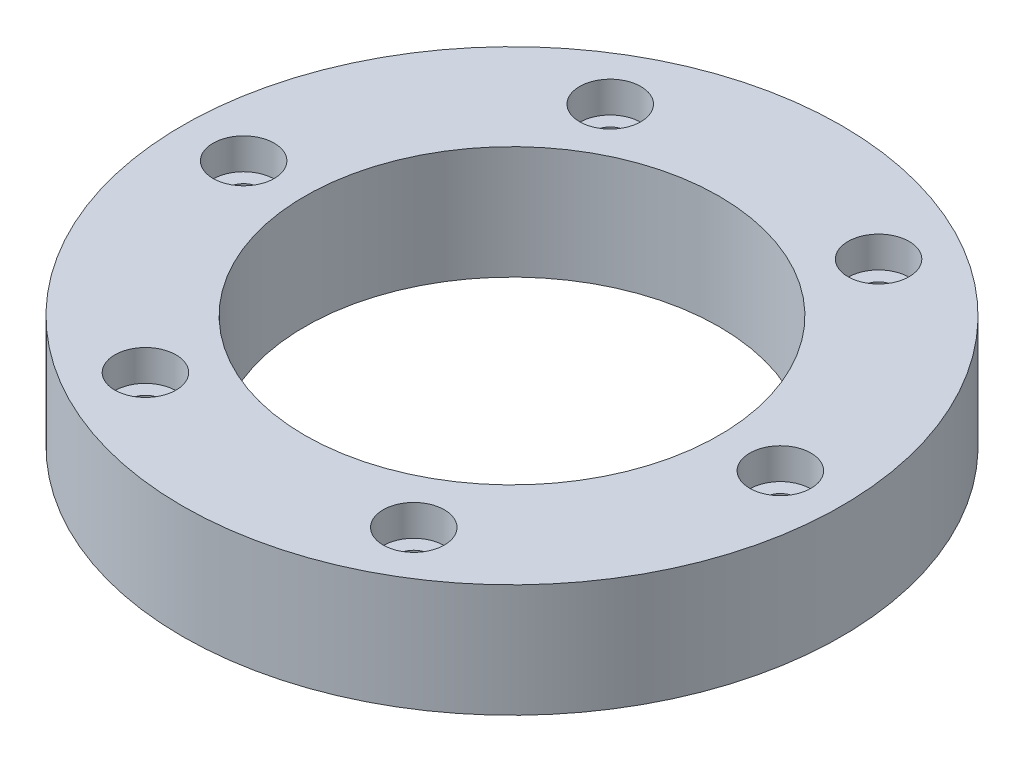
ISO-10303-21;
HEADER;
FILE_DESCRIPTION(('STEP AP214'),'2;1');
FILE_NAME('part.step','',(''),(''),'','','');
FILE_SCHEMA(('AUTOMOTIVE_DESIGN { 1 0 10303 214 1 1 1 1 }'));
ENDSEC;
DATA;
#1=APPLICATION_CONTEXT('core data for automotive mechanical design processes');
#2=APPLICATION_PROTOCOL_DEFINITION('international standard','automotive_design',2000,#1);
#3=PRODUCT_CONTEXT('',#1,'mechanical');
#4=PRODUCT('Part','Part','',(#3));
#5=PRODUCT_RELATED_PRODUCT_CATEGORY('part','',(#4));
#6=PRODUCT_DEFINITION_FORMATION('','',#4);
#7=PRODUCT_DEFINITION_CONTEXT('part definition',#1,'design');
#8=PRODUCT_DEFINITION('design','',#6,#7);
#9=PRODUCT_DEFINITION_SHAPE('','',#8);
#10=(LENGTH_UNIT() NAMED_UNIT(*) SI_UNIT(.MILLI.,.METRE.));
#11=(NAMED_UNIT(*) PLANE_ANGLE_UNIT() SI_UNIT($,.RADIAN.));
#12=(NAMED_UNIT(*) SI_UNIT($,.STERADIAN.) SOLID_ANGLE_UNIT());
#13=UNCERTAINTY_MEASURE_WITH_UNIT(LENGTH_MEASURE(1.E-05),#10,'distance_accuracy_value','');
#14=(GEOMETRIC_REPRESENTATION_CONTEXT(3) GLOBAL_UNCERTAINTY_ASSIGNED_CONTEXT((#13)) GLOBAL_UNIT_ASSIGNED_CONTEXT((#10,
#11,#12)) REPRESENTATION_CONTEXT('',''));
#15=CARTESIAN_POINT('',(0.,0.,0.));
#16=DIRECTION('',(0.,0.,1.));
#17=DIRECTION('',(1.,0.,0.));
#18=AXIS2_PLACEMENT_3D('',#15,#16,#17);
#19=CARTESIAN_POINT('',(-28.5,12.,0.));
#20=DIRECTION('',(0.,-1.,0.));
#21=DIRECTION('',(0.,0.,-1.));
#22=AXIS2_PLACEMENT_3D('',#19,#20,#21);
#23=CYLINDRICAL_SURFACE('',#22,1.7);
#24=CARTESIAN_POINT('',(-28.5,0.,0.));
#25=DIRECTION('',(0.,1.,0.));
#26=DIRECTION('',(0.,0.,1.));
#27=AXIS2_PLACEMENT_3D('',#24,#25,#26);
#28=CIRCLE('',#27,1.7);
#29=CARTESIAN_POINT('',(-28.5,0.,1.7));
#30=VERTEX_POINT('',#29);
#31=EDGE_CURVE('E49',#30,#30,#28,.T.);
#32=ORIENTED_EDGE('',*,*,#31,.F.);
#33=EDGE_LOOP('',(#32));
#34=FACE_BOUND('',#33,.T.);
#35=CARTESIAN_POINT('',(-28.5,8.7,0.));
#36=DIRECTION('',(0.,1.,0.));
#37=DIRECTION('',(0.,0.,1.));
#38=AXIS2_PLACEMENT_3D('',#35,#36,#37);
#39=CIRCLE('',#38,1.7);
#40=CARTESIAN_POINT('',(-28.5,8.7,1.7));
#41=VERTEX_POINT('',#40);
#42=EDGE_CURVE('E40',#41,#41,#39,.T.);
#43=ORIENTED_EDGE('',*,*,#42,.T.);
#44=EDGE_LOOP('',(#43));
#45=FACE_BOUND('',#44,.T.);
#46=ADVANCED_FACE('F36',(#34,#45),#23,.F.);
#47=CARTESIAN_POINT('',(-14.2499999999999,12.,-24.6817240078565));
#48=DIRECTION('',(0.,-1.,0.));
#49=DIRECTION('',(0.,0.,-1.));
#50=AXIS2_PLACEMENT_3D('',#47,#48,#49);
#51=CYLINDRICAL_SURFACE('',#50,1.7);
#52=CARTESIAN_POINT('',(-14.2499999999999,0.,-24.6817240078565));
#53=DIRECTION('',(0.,1.,0.));
#54=DIRECTION('',(0.,0.,1.));
#55=AXIS2_PLACEMENT_3D('',#52,#53,#54);
#56=CIRCLE('',#55,1.7);
#57=CARTESIAN_POINT('',(-14.2499999999999,0.,-22.9817240078565));
#58=VERTEX_POINT('',#57);
#59=EDGE_CURVE('E91',#58,#58,#56,.T.);
#60=ORIENTED_EDGE('',*,*,#59,.F.);
#61=EDGE_LOOP('',(#60));
#62=FACE_BOUND('',#61,.T.);
#63=CARTESIAN_POINT('',(-14.2499999999999,8.7,-24.6817240078565));
#64=DIRECTION('',(0.,1.,0.));
#65=DIRECTION('',(0.,0.,1.));
#66=AXIS2_PLACEMENT_3D('',#63,#64,#65);
#67=CIRCLE('',#66,1.7);
#68=CARTESIAN_POINT('',(-14.2499999999999,8.7,-22.9817240078565));
#69=VERTEX_POINT('',#68);
#70=EDGE_CURVE('E66',#69,#69,#67,.T.);
#71=ORIENTED_EDGE('',*,*,#70,.T.);
#72=EDGE_LOOP('',(#71));
#73=FACE_BOUND('',#72,.T.);
#74=ADVANCED_FACE('F119',(#62,#73),#51,.F.);
#75=CARTESIAN_POINT('',(14.2500000000001,12.,-24.6817240078564));
#76=DIRECTION('',(0.,-1.,0.));
#77=DIRECTION('',(0.,0.,-1.));
#78=AXIS2_PLACEMENT_3D('',#75,#76,#77);
#79=CYLINDRICAL_SURFACE('',#78,1.7);
#80=CARTESIAN_POINT('',(14.2500000000001,0.,-24.6817240078564));
#81=DIRECTION('',(0.,1.,0.));
#82=DIRECTION('',(0.,0.,1.));
#83=AXIS2_PLACEMENT_3D('',#80,#81,#82);
#84=CIRCLE('',#83,1.7);
#85=CARTESIAN_POINT('',(14.2500000000001,0.,-22.9817240078564));
#86=VERTEX_POINT('',#85);
#87=EDGE_CURVE('E88',#86,#86,#84,.T.);
#88=ORIENTED_EDGE('',*,*,#87,.F.);
#89=EDGE_LOOP('',(#88));
#90=FACE_BOUND('',#89,.T.);
#91=CARTESIAN_POINT('',(14.2500000000001,8.7,-24.6817240078564));
#92=DIRECTION('',(0.,1.,0.));
#93=DIRECTION('',(0.,0.,1.));
#94=AXIS2_PLACEMENT_3D('',#91,#92,#93);
#95=CIRCLE('',#94,1.7);
#96=CARTESIAN_POINT('',(14.2500000000001,8.7,-22.9817240078564));
#97=VERTEX_POINT('',#96);
#98=EDGE_CURVE('E64',#97,#97,#95,.T.);
#99=ORIENTED_EDGE('',*,*,#98,.T.);
#100=EDGE_LOOP('',(#99));
#101=FACE_BOUND('',#100,.T.);
#102=ADVANCED_FACE('F124',(#90,#101),#79,.F.);
#103=CARTESIAN_POINT('',(28.5,12.,1.99014436314059E-13));
#104=DIRECTION('',(0.,-1.,0.));
#105=DIRECTION('',(0.,0.,-1.));
#106=AXIS2_PLACEMENT_3D('',#103,#104,#105);
#107=CYLINDRICAL_SURFACE('',#106,1.7);
#108=CARTESIAN_POINT('',(28.5,0.,1.99014436314059E-13));
#109=DIRECTION('',(0.,1.,0.));
#110=DIRECTION('',(0.,0.,1.));
#111=AXIS2_PLACEMENT_3D('',#108,#109,#110);
#112=CIRCLE('',#111,1.7);
#113=CARTESIAN_POINT('',(28.5,0.,1.7000000000002));
#114=VERTEX_POINT('',#113);
#115=EDGE_CURVE('E80',#114,#114,#112,.T.);
#116=ORIENTED_EDGE('',*,*,#115,.F.);
#117=EDGE_LOOP('',(#116));
#118=FACE_BOUND('',#117,.T.);
#119=CARTESIAN_POINT('',(28.5,8.7,1.99014436314059E-13));
#120=DIRECTION('',(0.,1.,0.));
#121=DIRECTION('',(0.,0.,1.));
#122=AXIS2_PLACEMENT_3D('',#119,#120,#121);
#123=CIRCLE('',#122,1.7);
#124=CARTESIAN_POINT('',(28.5,8.7,1.7000000000002));
#125=VERTEX_POINT('',#124);
#126=EDGE_CURVE('E61',#125,#125,#123,.T.);
#127=ORIENTED_EDGE('',*,*,#126,.T.);
#128=EDGE_LOOP('',(#127));
#129=FACE_BOUND('',#128,.T.);
#130=ADVANCED_FACE('F174',(#118,#129),#107,.F.);
#131=CARTESIAN_POINT('',(14.2499999999998,12.,24.6817240078566));
#132=DIRECTION('',(0.,-1.,0.));
#133=DIRECTION('',(0.,0.,-1.));
#134=AXIS2_PLACEMENT_3D('',#131,#132,#133);
#135=CYLINDRICAL_SURFACE('',#134,1.7);
#136=CARTESIAN_POINT('',(14.2499999999998,0.,24.6817240078566));
#137=DIRECTION('',(0.,1.,0.));
#138=DIRECTION('',(0.,0.,1.));
#139=AXIS2_PLACEMENT_3D('',#136,#137,#138);
#140=CIRCLE('',#139,1.7);
#141=CARTESIAN_POINT('',(14.2499999999998,0.,26.3817240078566));
#142=VERTEX_POINT('',#141);
#143=EDGE_CURVE('E75',#142,#142,#140,.T.);
#144=ORIENTED_EDGE('',*,*,#143,.F.);
#145=EDGE_LOOP('',(#144));
#146=FACE_BOUND('',#145,.T.);
#147=CARTESIAN_POINT('',(14.2499999999998,8.7,24.6817240078566));
#148=DIRECTION('',(0.,1.,0.));
#149=DIRECTION('',(0.,0.,1.));
#150=AXIS2_PLACEMENT_3D('',#147,#148,#149);
#151=CIRCLE('',#150,1.7);
#152=CARTESIAN_POINT('',(14.2499999999998,8.7,26.3817240078566));
#153=VERTEX_POINT('',#152);
#154=EDGE_CURVE('E57',#153,#153,#151,.T.);
#155=ORIENTED_EDGE('',*,*,#154,.T.);
#156=EDGE_LOOP('',(#155));
#157=FACE_BOUND('',#156,.T.);
#158=ADVANCED_FACE('F184',(#146,#157),#135,.F.);
#159=CARTESIAN_POINT('',(-14.2500000000003,12.,24.6817240078563));
#160=DIRECTION('',(0.,-1.,0.));
#161=DIRECTION('',(0.,0.,-1.));
#162=AXIS2_PLACEMENT_3D('',#159,#160,#161);
#163=CYLINDRICAL_SURFACE('',#162,1.7);
#164=CARTESIAN_POINT('',(-14.2500000000003,0.,24.6817240078563));
#165=DIRECTION('',(0.,1.,0.));
#166=DIRECTION('',(0.,0.,1.));
#167=AXIS2_PLACEMENT_3D('',#164,#165,#166);
#168=CIRCLE('',#167,1.7);
#169=CARTESIAN_POINT('',(-14.2500000000003,0.,26.3817240078563));
#170=VERTEX_POINT('',#169);
#171=EDGE_CURVE('E71',#170,#170,#168,.T.);
#172=ORIENTED_EDGE('',*,*,#171,.F.);
#173=EDGE_LOOP('',(#172));
#174=FACE_BOUND('',#173,.T.);
#175=CARTESIAN_POINT('',(-14.2500000000003,8.7,24.6817240078563));
#176=DIRECTION('',(0.,1.,0.));
#177=DIRECTION('',(0.,0.,1.));
#178=AXIS2_PLACEMENT_3D('',#175,#176,#177);
#179=CIRCLE('',#178,1.7);
#180=CARTESIAN_POINT('',(-14.2500000000003,8.7,26.3817240078563));
#181=VERTEX_POINT('',#180);
#182=EDGE_CURVE('E54',#181,#181,#179,.T.);
#183=ORIENTED_EDGE('',*,*,#182,.T.);
#184=EDGE_LOOP('',(#183));
#185=FACE_BOUND('',#184,.T.);
#186=ADVANCED_FACE('F130',(#174,#185),#163,.F.);
#187=CARTESIAN_POINT('',(0.,12.,0.));
#188=DIRECTION('',(0.,1.,0.));
#189=DIRECTION('',(0.,0.,1.));
#190=AXIS2_PLACEMENT_3D('',#187,#188,#189);
#191=PLANE('',#190);
#192=CARTESIAN_POINT('',(-28.5,12.,0.));
#193=DIRECTION('',(0.,1.,0.));
#194=DIRECTION('',(0.,0.,1.));
#195=AXIS2_PLACEMENT_3D('',#192,#193,#194);
#196=CIRCLE('',#195,3.25);
#197=CARTESIAN_POINT('',(-28.5,12.,3.25));
#198=VERTEX_POINT('',#197);
#199=EDGE_CURVE('E351',#198,#198,#196,.T.);
#200=ORIENTED_EDGE('',*,*,#199,.F.);
#201=EDGE_LOOP('',(#200));
#202=FACE_BOUND('',#201,.T.);
#203=CARTESIAN_POINT('',(-14.2500000000003,12.,24.6817240078563));
#204=DIRECTION('',(0.,1.,0.));
#205=DIRECTION('',(0.,0.,1.));
#206=AXIS2_PLACEMENT_3D('',#203,#204,#205);
#207=CIRCLE('',#206,3.25);
#208=CARTESIAN_POINT('',(-14.2500000000003,12.,27.9317240078563));
#209=VERTEX_POINT('',#208);
#210=EDGE_CURVE('E357',#209,#209,#207,.T.);
#211=ORIENTED_EDGE('',*,*,#210,.F.);
#212=EDGE_LOOP('',(#211));
#213=FACE_BOUND('',#212,.T.);
#214=CARTESIAN_POINT('',(14.2499999999998,12.,24.6817240078566));
#215=DIRECTION('',(0.,1.,0.));
#216=DIRECTION('',(0.,0.,1.));
#217=AXIS2_PLACEMENT_3D('',#214,#215,#216);
#218=CIRCLE('',#217,3.25);
#219=CARTESIAN_POINT('',(14.2499999999998,12.,27.9317240078566));
#220=VERTEX_POINT('',#219);
#221=EDGE_CURVE('E379',#220,#220,#218,.T.);
#222=ORIENTED_EDGE('',*,*,#221,.F.);
#223=EDGE_LOOP('',(#222));
#224=FACE_BOUND('',#223,.T.);
#225=CARTESIAN_POINT('',(28.5,12.,1.99014436314059E-13));
#226=DIRECTION('',(0.,1.,0.));
#227=DIRECTION('',(0.,0.,1.));
#228=AXIS2_PLACEMENT_3D('',#225,#226,#227);
#229=CIRCLE('',#228,3.25);
#230=CARTESIAN_POINT('',(28.5,12.,3.2500000000002));
#231=VERTEX_POINT('',#230);
#232=EDGE_CURVE('E374',#231,#231,#229,.T.);
#233=ORIENTED_EDGE('',*,*,#232,.F.);
#234=EDGE_LOOP('',(#233));
#235=FACE_BOUND('',#234,.T.);
#236=CARTESIAN_POINT('',(14.2500000000001,12.,-24.6817240078564));
#237=DIRECTION('',(0.,1.,0.));
#238=DIRECTION('',(0.,0.,1.));
#239=AXIS2_PLACEMENT_3D('',#236,#237,#238);
#240=CIRCLE('',#239,3.25);
#241=CARTESIAN_POINT('',(14.2500000000001,12.,-21.4317240078564));
#242=VERTEX_POINT('',#241);
#243=EDGE_CURVE('E368',#242,#242,#240,.T.);
#244=ORIENTED_EDGE('',*,*,#243,.F.);
#245=EDGE_LOOP('',(#244));
#246=FACE_BOUND('',#245,.T.);
#247=CARTESIAN_POINT('',(-14.2499999999999,12.,-24.6817240078565));
#248=DIRECTION('',(0.,1.,0.));
#249=DIRECTION('',(0.,0.,1.));
#250=AXIS2_PLACEMENT_3D('',#247,#248,#249);
#251=CIRCLE('',#250,3.25);
#252=CARTESIAN_POINT('',(-14.2499999999999,12.,-21.4317240078565));
#253=VERTEX_POINT('',#252);
#254=EDGE_CURVE('E354',#253,#253,#251,.T.);
#255=ORIENTED_EDGE('',*,*,#254,.F.);
#256=EDGE_LOOP('',(#255));
#257=FACE_BOUND('',#256,.T.);
#258=CARTESIAN_POINT('',(0.,12.,0.));
#259=DIRECTION('',(0.,1.,0.));
#260=DIRECTION('',(0.,0.,1.));
#261=AXIS2_PLACEMENT_3D('',#258,#259,#260);
#262=CIRCLE('',#261,22.);
#263=CARTESIAN_POINT('',(0.,12.,22.));
#264=VERTEX_POINT('',#263);
#265=EDGE_CURVE('E95',#264,#264,#262,.T.);
#266=ORIENTED_EDGE('',*,*,#265,.F.);
#267=EDGE_LOOP('',(#266));
#268=FACE_BOUND('',#267,.T.);
#269=CARTESIAN_POINT('',(0.,12.,0.));
#270=DIRECTION('',(0.,1.,0.));
#271=DIRECTION('',(0.,0.,1.));
#272=AXIS2_PLACEMENT_3D('',#269,#270,#271);
#273=CIRCLE('',#272,35.);
#274=CARTESIAN_POINT('',(0.,12.,35.));
#275=VERTEX_POINT('',#274);
#276=EDGE_CURVE('E10',#275,#275,#273,.T.);
#277=ORIENTED_EDGE('',*,*,#276,.T.);
#278=EDGE_LOOP('',(#277));
#279=FACE_BOUND('',#278,.T.);
#280=ADVANCED_FACE('F128',(#202,#213,#224,#235,#246,#257,#268,#279),#191,.T.);
#281=CARTESIAN_POINT('',(0.,0.,0.));
#282=DIRECTION('',(0.,1.,0.));
#283=DIRECTION('',(0.,0.,1.));
#284=AXIS2_PLACEMENT_3D('',#281,#282,#283);
#285=PLANE('',#284);
#286=CARTESIAN_POINT('',(0.,0.,0.));
#287=DIRECTION('',(0.,1.,0.));
#288=DIRECTION('',(0.,0.,1.));
#289=AXIS2_PLACEMENT_3D('',#286,#287,#288);
#290=CIRCLE('',#289,35.);
#291=CARTESIAN_POINT('',(0.,0.,35.));
#292=VERTEX_POINT('',#291);
#293=EDGE_CURVE('E44',#292,#292,#290,.T.);
#294=ORIENTED_EDGE('',*,*,#293,.F.);
#295=EDGE_LOOP('',(#294));
#296=FACE_BOUND('',#295,.T.);
#297=ORIENTED_EDGE('',*,*,#31,.T.);
#298=EDGE_LOOP('',(#297));
#299=FACE_BOUND('',#298,.T.);
#300=CARTESIAN_POINT('',(0.,0.,0.));
#301=DIRECTION('',(0.,1.,0.));
#302=DIRECTION('',(0.,0.,1.));
#303=AXIS2_PLACEMENT_3D('',#300,#301,#302);
#304=CIRCLE('',#303,22.);
#305=CARTESIAN_POINT('',(0.,0.,22.));
#306=VERTEX_POINT('',#305);
#307=EDGE_CURVE('E94',#306,#306,#304,.T.);
#308=ORIENTED_EDGE('',*,*,#307,.T.);
#309=EDGE_LOOP('',(#308));
#310=FACE_BOUND('',#309,.T.);
#311=ORIENTED_EDGE('',*,*,#59,.T.);
#312=EDGE_LOOP('',(#311));
#313=FACE_BOUND('',#312,.T.);
#314=ORIENTED_EDGE('',*,*,#87,.T.);
#315=EDGE_LOOP('',(#314));
#316=FACE_BOUND('',#315,.T.);
#317=ORIENTED_EDGE('',*,*,#115,.T.);
#318=EDGE_LOOP('',(#317));
#319=FACE_BOUND('',#318,.T.);
#320=ORIENTED_EDGE('',*,*,#143,.T.);
#321=EDGE_LOOP('',(#320));
#322=FACE_BOUND('',#321,.T.);
#323=ORIENTED_EDGE('',*,*,#171,.T.);
#324=EDGE_LOOP('',(#323));
#325=FACE_BOUND('',#324,.T.);
#326=ADVANCED_FACE('F100',(#296,#299,#310,#313,#316,#319,#322,#325),#285,.F.);
#327=CARTESIAN_POINT('',(0.,12.,0.));
#328=DIRECTION('',(0.,-1.,0.));
#329=DIRECTION('',(0.,0.,-1.));
#330=AXIS2_PLACEMENT_3D('',#327,#328,#329);
#331=CYLINDRICAL_SURFACE('',#330,35.);
#332=ORIENTED_EDGE('',*,*,#276,.F.);
#333=EDGE_LOOP('',(#332));
#334=FACE_BOUND('',#333,.T.);
#335=ORIENTED_EDGE('',*,*,#293,.T.);
#336=EDGE_LOOP('',(#335));
#337=FACE_BOUND('',#336,.T.);
#338=ADVANCED_FACE('F38',(#334,#337),#331,.T.);
#339=CARTESIAN_POINT('',(0.,12.,0.));
#340=DIRECTION('',(0.,-1.,0.));
#341=DIRECTION('',(0.,0.,-1.));
#342=AXIS2_PLACEMENT_3D('',#339,#340,#341);
#343=CYLINDRICAL_SURFACE('',#342,22.);
#344=ORIENTED_EDGE('',*,*,#265,.T.);
#345=EDGE_LOOP('',(#344));
#346=FACE_BOUND('',#345,.T.);
#347=ORIENTED_EDGE('',*,*,#307,.F.);
#348=EDGE_LOOP('',(#347));
#349=FACE_BOUND('',#348,.T.);
#350=ADVANCED_FACE('F103',(#346,#349),#343,.F.);
#351=CARTESIAN_POINT('',(-14.2500000000003,8.7,24.6817240078563));
#352=DIRECTION('',(0.,1.,0.));
#353=DIRECTION('',(0.,0.,1.));
#354=AXIS2_PLACEMENT_3D('',#351,#352,#353);
#355=CYLINDRICAL_SURFACE('',#354,3.25);
#356=CARTESIAN_POINT('',(-14.2500000000003,8.7,24.6817240078563));
#357=DIRECTION('',(0.,1.,0.));
#358=DIRECTION('',(0.,0.,1.));
#359=AXIS2_PLACEMENT_3D('',#356,#357,#358);
#360=CIRCLE('',#359,3.25);
#361=CARTESIAN_POINT('',(-14.2500000000003,8.7,27.9317240078563));
#362=VERTEX_POINT('',#361);
#363=EDGE_CURVE('E360',#362,#362,#360,.T.);
#364=ORIENTED_EDGE('',*,*,#363,.F.);
#365=EDGE_LOOP('',(#364));
#366=FACE_BOUND('',#365,.T.);
#367=ORIENTED_EDGE('',*,*,#210,.T.);
#368=EDGE_LOOP('',(#367));
#369=FACE_BOUND('',#368,.T.);
#370=ADVANCED_FACE('F105',(#366,#369),#355,.F.);
#371=CARTESIAN_POINT('',(-14.2500000000003,8.7,24.6817240078563));
#372=DIRECTION('',(0.,1.,0.));
#373=DIRECTION('',(0.,0.,1.));
#374=AXIS2_PLACEMENT_3D('',#371,#372,#373);
#375=PLANE('',#374);
#376=ORIENTED_EDGE('',*,*,#182,.F.);
#377=EDGE_LOOP('',(#376));
#378=FACE_BOUND('',#377,.T.);
#379=ORIENTED_EDGE('',*,*,#363,.T.);
#380=EDGE_LOOP('',(#379));
#381=FACE_BOUND('',#380,.T.);
#382=ADVANCED_FACE('F112',(#378,#381),#375,.T.);
#383=CARTESIAN_POINT('',(14.2499999999998,8.7,24.6817240078566));
#384=DIRECTION('',(0.,1.,0.));
#385=DIRECTION('',(0.,0.,1.));
#386=AXIS2_PLACEMENT_3D('',#383,#384,#385);
#387=CYLINDRICAL_SURFACE('',#386,3.25);
#388=CARTESIAN_POINT('',(14.2499999999998,8.7,24.6817240078566));
#389=DIRECTION('',(0.,1.,0.));
#390=DIRECTION('',(0.,0.,1.));
#391=AXIS2_PLACEMENT_3D('',#388,#389,#390);
#392=CIRCLE('',#391,3.25);
#393=CARTESIAN_POINT('',(14.2499999999998,8.7,27.9317240078566));
#394=VERTEX_POINT('',#393);
#395=EDGE_CURVE('E83',#394,#394,#392,.T.);
#396=ORIENTED_EDGE('',*,*,#395,.F.);
#397=EDGE_LOOP('',(#396));
#398=FACE_BOUND('',#397,.T.);
#399=ORIENTED_EDGE('',*,*,#221,.T.);
#400=EDGE_LOOP('',(#399));
#401=FACE_BOUND('',#400,.T.);
#402=ADVANCED_FACE('F221',(#398,#401),#387,.F.);
#403=CARTESIAN_POINT('',(14.2499999999998,8.7,24.6817240078566));
#404=DIRECTION('',(0.,1.,0.));
#405=DIRECTION('',(0.,0.,1.));
#406=AXIS2_PLACEMENT_3D('',#403,#404,#405);
#407=PLANE('',#406);
#408=ORIENTED_EDGE('',*,*,#154,.F.);
#409=EDGE_LOOP('',(#408));
#410=FACE_BOUND('',#409,.T.);
#411=ORIENTED_EDGE('',*,*,#395,.T.);
#412=EDGE_LOOP('',(#411));
#413=FACE_BOUND('',#412,.T.);
#414=ADVANCED_FACE('F232',(#410,#413),#407,.T.);
#415=CARTESIAN_POINT('',(28.5,8.7,1.99014436314059E-13));
#416=DIRECTION('',(0.,1.,0.));
#417=DIRECTION('',(0.,0.,1.));
#418=AXIS2_PLACEMENT_3D('',#415,#416,#417);
#419=CYLINDRICAL_SURFACE('',#418,3.25);
#420=CARTESIAN_POINT('',(28.5,8.7,1.99014436314059E-13));
#421=DIRECTION('',(0.,1.,0.));
#422=DIRECTION('',(0.,0.,1.));
#423=AXIS2_PLACEMENT_3D('',#420,#421,#422);
#424=CIRCLE('',#423,3.25);
#425=CARTESIAN_POINT('',(28.5,8.7,3.2500000000002));
#426=VERTEX_POINT('',#425);
#427=EDGE_CURVE('E377',#426,#426,#424,.T.);
#428=ORIENTED_EDGE('',*,*,#427,.F.);
#429=EDGE_LOOP('',(#428));
#430=FACE_BOUND('',#429,.T.);
#431=ORIENTED_EDGE('',*,*,#232,.T.);
#432=EDGE_LOOP('',(#431));
#433=FACE_BOUND('',#432,.T.);
#434=ADVANCED_FACE('F243',(#430,#433),#419,.F.);
#435=CARTESIAN_POINT('',(28.5,8.7,1.99014436314059E-13));
#436=DIRECTION('',(0.,1.,0.));
#437=DIRECTION('',(0.,0.,1.));
#438=AXIS2_PLACEMENT_3D('',#435,#436,#437);
#439=PLANE('',#438);
#440=ORIENTED_EDGE('',*,*,#126,.F.);
#441=EDGE_LOOP('',(#440));
#442=FACE_BOUND('',#441,.T.);
#443=ORIENTED_EDGE('',*,*,#427,.T.);
#444=EDGE_LOOP('',(#443));
#445=FACE_BOUND('',#444,.T.);
#446=ADVANCED_FACE('F254',(#442,#445),#439,.T.);
#447=CARTESIAN_POINT('',(14.2500000000001,8.7,-24.6817240078564));
#448=DIRECTION('',(0.,1.,0.));
#449=DIRECTION('',(0.,0.,1.));
#450=AXIS2_PLACEMENT_3D('',#447,#448,#449);
#451=CYLINDRICAL_SURFACE('',#450,3.25);
#452=CARTESIAN_POINT('',(14.2500000000001,8.7,-24.6817240078564));
#453=DIRECTION('',(0.,1.,0.));
#454=DIRECTION('',(0.,0.,1.));
#455=AXIS2_PLACEMENT_3D('',#452,#453,#454);
#456=CIRCLE('',#455,3.25);
#457=CARTESIAN_POINT('',(14.2500000000001,8.7,-21.4317240078564));
#458=VERTEX_POINT('',#457);
#459=EDGE_CURVE('E371',#458,#458,#456,.T.);
#460=ORIENTED_EDGE('',*,*,#459,.F.);
#461=EDGE_LOOP('',(#460));
#462=FACE_BOUND('',#461,.T.);
#463=ORIENTED_EDGE('',*,*,#243,.T.);
#464=EDGE_LOOP('',(#463));
#465=FACE_BOUND('',#464,.T.);
#466=ADVANCED_FACE('F265',(#462,#465),#451,.F.);
#467=CARTESIAN_POINT('',(14.2500000000001,8.7,-24.6817240078564));
#468=DIRECTION('',(0.,1.,0.));
#469=DIRECTION('',(0.,0.,1.));
#470=AXIS2_PLACEMENT_3D('',#467,#468,#469);
#471=PLANE('',#470);
#472=ORIENTED_EDGE('',*,*,#98,.F.);
#473=EDGE_LOOP('',(#472));
#474=FACE_BOUND('',#473,.T.);
#475=ORIENTED_EDGE('',*,*,#459,.T.);
#476=EDGE_LOOP('',(#475));
#477=FACE_BOUND('',#476,.T.);
#478=ADVANCED_FACE('F276',(#474,#477),#471,.T.);
#479=CARTESIAN_POINT('',(-14.2499999999999,8.7,-24.6817240078565));
#480=DIRECTION('',(0.,1.,0.));
#481=DIRECTION('',(0.,0.,1.));
#482=AXIS2_PLACEMENT_3D('',#479,#480,#481);
#483=CYLINDRICAL_SURFACE('',#482,3.25);
#484=CARTESIAN_POINT('',(-14.2499999999999,8.7,-24.6817240078565));
#485=DIRECTION('',(0.,1.,0.));
#486=DIRECTION('',(0.,0.,1.));
#487=AXIS2_PLACEMENT_3D('',#484,#485,#486);
#488=CIRCLE('',#487,3.25);
#489=CARTESIAN_POINT('',(-14.2499999999999,8.7,-21.4317240078565));
#490=VERTEX_POINT('',#489);
#491=EDGE_CURVE('E365',#490,#490,#488,.T.);
#492=ORIENTED_EDGE('',*,*,#491,.F.);
#493=EDGE_LOOP('',(#492));
#494=FACE_BOUND('',#493,.T.);
#495=ORIENTED_EDGE('',*,*,#254,.T.);
#496=EDGE_LOOP('',(#495));
#497=FACE_BOUND('',#496,.T.);
#498=ADVANCED_FACE('F287',(#494,#497),#483,.F.);
#499=CARTESIAN_POINT('',(-14.2499999999999,8.7,-24.6817240078565));
#500=DIRECTION('',(0.,1.,0.));
#501=DIRECTION('',(0.,0.,1.));
#502=AXIS2_PLACEMENT_3D('',#499,#500,#501);
#503=PLANE('',#502);
#504=ORIENTED_EDGE('',*,*,#70,.F.);
#505=EDGE_LOOP('',(#504));
#506=FACE_BOUND('',#505,.T.);
#507=ORIENTED_EDGE('',*,*,#491,.T.);
#508=EDGE_LOOP('',(#507));
#509=FACE_BOUND('',#508,.T.);
#510=ADVANCED_FACE('F298',(#506,#509),#503,.T.);
#511=CARTESIAN_POINT('',(-28.5,8.7,0.));
#512=DIRECTION('',(0.,1.,0.));
#513=DIRECTION('',(0.,0.,1.));
#514=AXIS2_PLACEMENT_3D('',#511,#512,#513);
#515=CYLINDRICAL_SURFACE('',#514,3.25);
#516=CARTESIAN_POINT('',(-28.5,8.7,0.));
#517=DIRECTION('',(0.,1.,0.));
#518=DIRECTION('',(0.,0.,1.));
#519=AXIS2_PLACEMENT_3D('',#516,#517,#518);
#520=CIRCLE('',#519,3.25);
#521=CARTESIAN_POINT('',(-28.5,8.7,3.25));
#522=VERTEX_POINT('',#521);
#523=EDGE_CURVE('E58',#522,#522,#520,.T.);
#524=ORIENTED_EDGE('',*,*,#523,.F.);
#525=EDGE_LOOP('',(#524));
#526=FACE_BOUND('',#525,.T.);
#527=ORIENTED_EDGE('',*,*,#199,.T.);
#528=EDGE_LOOP('',(#527));
#529=FACE_BOUND('',#528,.T.);
#530=ADVANCED_FACE('F309',(#526,#529),#515,.F.);
#531=CARTESIAN_POINT('',(-28.5,8.7,0.));
#532=DIRECTION('',(0.,1.,0.));
#533=DIRECTION('',(0.,0.,1.));
#534=AXIS2_PLACEMENT_3D('',#531,#532,#533);
#535=PLANE('',#534);
#536=ORIENTED_EDGE('',*,*,#42,.F.);
#537=EDGE_LOOP('',(#536));
#538=FACE_BOUND('',#537,.T.);
#539=ORIENTED_EDGE('',*,*,#523,.T.);
#540=EDGE_LOOP('',(#539));
#541=FACE_BOUND('',#540,.T.);
#542=ADVANCED_FACE('F320',(#538,#541),#535,.T.);
#543=CLOSED_SHELL('',(#46,#74,#102,#130,#158,#186,#280,#326,#338,#350,#370,#382,#402,#414,#434,
#446,#466,#478,#498,#510,#530,#542));
#544=MANIFOLD_SOLID_BREP('B2',#543);
#545=ADVANCED_BREP_SHAPE_REPRESENTATION('',(#18,#544),#14);
#546=SHAPE_DEFINITION_REPRESENTATION(#9,#545);
ENDSEC;
END-ISO-10303-21;
